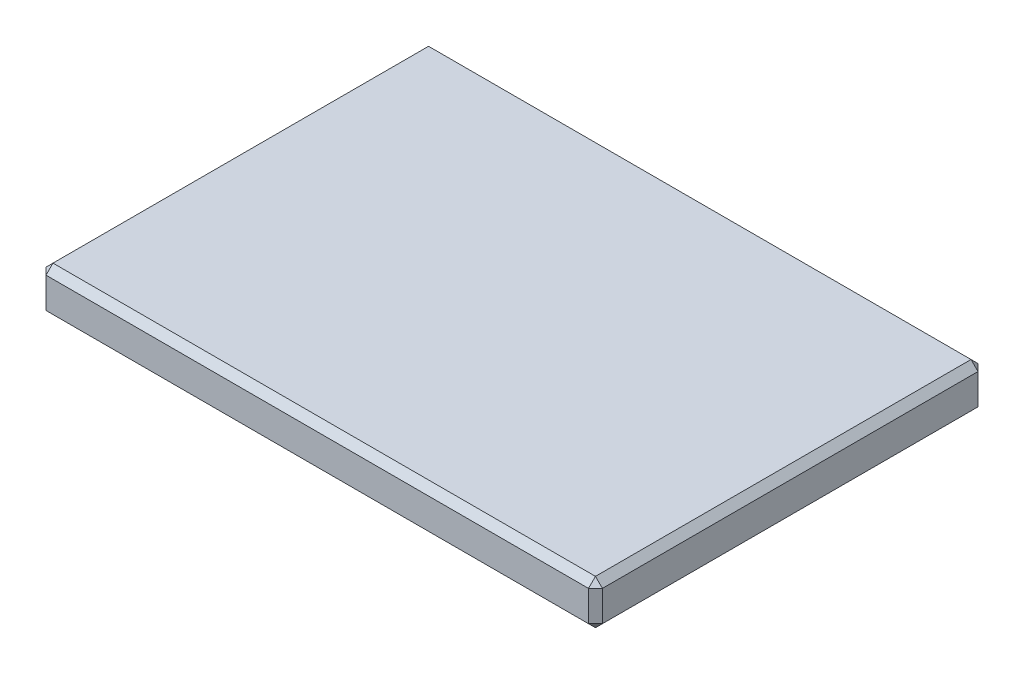
ISO-10303-21;
HEADER;
FILE_DESCRIPTION(('STEP AP214'),'2;1');
FILE_NAME('part.step','',(''),(''),'','','');
FILE_SCHEMA(('AUTOMOTIVE_DESIGN { 1 0 10303 214 1 1 1 1 }'));
ENDSEC;
DATA;
#1=APPLICATION_CONTEXT('core data for automotive mechanical design processes');
#2=APPLICATION_PROTOCOL_DEFINITION('international standard','automotive_design',2000,#1);
#3=PRODUCT_CONTEXT('',#1,'mechanical');
#4=PRODUCT('Part','Part','',(#3));
#5=PRODUCT_RELATED_PRODUCT_CATEGORY('part','',(#4));
#6=PRODUCT_DEFINITION_FORMATION('','',#4);
#7=PRODUCT_DEFINITION_CONTEXT('part definition',#1,'design');
#8=PRODUCT_DEFINITION('design','',#6,#7);
#9=PRODUCT_DEFINITION_SHAPE('','',#8);
#10=(LENGTH_UNIT() NAMED_UNIT(*) SI_UNIT(.MILLI.,.METRE.));
#11=(NAMED_UNIT(*) PLANE_ANGLE_UNIT() SI_UNIT($,.RADIAN.));
#12=(NAMED_UNIT(*) SI_UNIT($,.STERADIAN.) SOLID_ANGLE_UNIT());
#13=UNCERTAINTY_MEASURE_WITH_UNIT(LENGTH_MEASURE(1.E-05),#10,'distance_accuracy_value','');
#14=(GEOMETRIC_REPRESENTATION_CONTEXT(3) GLOBAL_UNCERTAINTY_ASSIGNED_CONTEXT((#13)) GLOBAL_UNIT_ASSIGNED_CONTEXT((#10,
#11,#12)) REPRESENTATION_CONTEXT('',''));
#15=CARTESIAN_POINT('',(0.,0.,0.));
#16=DIRECTION('',(0.,0.,1.));
#17=DIRECTION('',(1.,0.,0.));
#18=AXIS2_PLACEMENT_3D('',#15,#16,#17);
#19=CARTESIAN_POINT('',(0.,3.2,0.));
#20=DIRECTION('',(1.,0.,0.));
#21=DIRECTION('',(0.,0.,-1.));
#22=AXIS2_PLACEMENT_3D('',#19,#20,#21);
#23=PLANE('',#22);
#24=DIRECTION('',(0.,0.,1.));
#25=VECTOR('',#24,1.);
#26=CARTESIAN_POINT('',(0.,0.5,0.));
#27=LINE('',#26,#25);
#28=CARTESIAN_POINT('',(0.,0.5,-27.5));
#29=VERTEX_POINT('',#28);
#30=CARTESIAN_POINT('',(0.,0.5,-0.5));
#31=VERTEX_POINT('',#30);
#32=EDGE_CURVE('E197',#29,#31,#27,.T.);
#33=ORIENTED_EDGE('',*,*,#32,.T.);
#34=DIRECTION('',(0.,1.,0.));
#35=VECTOR('',#34,1.);
#36=CARTESIAN_POINT('',(0.,3.2,-0.5));
#37=LINE('',#36,#35);
#38=CARTESIAN_POINT('',(0.,2.7,-0.5));
#39=VERTEX_POINT('',#38);
#40=EDGE_CURVE('E200',#31,#39,#37,.T.);
#41=ORIENTED_EDGE('',*,*,#40,.T.);
#42=DIRECTION('',(0.,0.,-1.));
#43=VECTOR('',#42,1.);
#44=CARTESIAN_POINT('',(0.,2.7,0.));
#45=LINE('',#44,#43);
#46=CARTESIAN_POINT('',(0.,2.7,-27.5));
#47=VERTEX_POINT('',#46);
#48=EDGE_CURVE('E191',#39,#47,#45,.T.);
#49=ORIENTED_EDGE('',*,*,#48,.T.);
#50=DIRECTION('',(0.,-1.,0.));
#51=VECTOR('',#50,1.);
#52=CARTESIAN_POINT('',(0.,3.2,-27.5));
#53=LINE('',#52,#51);
#54=EDGE_CURVE('E194',#47,#29,#53,.T.);
#55=ORIENTED_EDGE('',*,*,#54,.T.);
#56=EDGE_LOOP('',(#33,#41,#49,#55));
#57=FACE_BOUND('',#56,.T.);
#58=ADVANCED_FACE('F39',(#57),#23,.F.);
#59=CARTESIAN_POINT('',(0.,3.2,0.));
#60=DIRECTION('',(0.,0.,-1.));
#61=DIRECTION('',(-1.,0.,0.));
#62=AXIS2_PLACEMENT_3D('',#59,#60,#61);
#63=PLANE('',#62);
#64=DIRECTION('',(0.,-1.,0.));
#65=VECTOR('',#64,1.);
#66=CARTESIAN_POINT('',(0.5,3.2,0.));
#67=LINE('',#66,#65);
#68=CARTESIAN_POINT('',(0.5,2.7,0.));
#69=VERTEX_POINT('',#68);
#70=CARTESIAN_POINT('',(0.5,0.5,0.));
#71=VERTEX_POINT('',#70);
#72=EDGE_CURVE('E181',#69,#71,#67,.T.);
#73=ORIENTED_EDGE('',*,*,#72,.T.);
#74=DIRECTION('',(1.,0.,0.));
#75=VECTOR('',#74,1.);
#76=CARTESIAN_POINT('',(40.,0.5,0.));
#77=LINE('',#76,#75);
#78=CARTESIAN_POINT('',(39.5,0.5,0.));
#79=VERTEX_POINT('',#78);
#80=EDGE_CURVE('E188',#71,#79,#77,.T.);
#81=ORIENTED_EDGE('',*,*,#80,.T.);
#82=DIRECTION('',(0.,1.,0.));
#83=VECTOR('',#82,1.);
#84=CARTESIAN_POINT('',(39.5,3.2,0.));
#85=LINE('',#84,#83);
#86=CARTESIAN_POINT('',(39.5,2.7,0.));
#87=VERTEX_POINT('',#86);
#88=EDGE_CURVE('E184',#79,#87,#85,.T.);
#89=ORIENTED_EDGE('',*,*,#88,.T.);
#90=DIRECTION('',(-1.,0.,0.));
#91=VECTOR('',#90,1.);
#92=CARTESIAN_POINT('',(0.,2.7,0.));
#93=LINE('',#92,#91);
#94=EDGE_CURVE('E178',#87,#69,#93,.T.);
#95=ORIENTED_EDGE('',*,*,#94,.T.);
#96=EDGE_LOOP('',(#73,#81,#89,#95));
#97=FACE_BOUND('',#96,.T.);
#98=ADVANCED_FACE('F358',(#97),#63,.F.);
#99=CARTESIAN_POINT('',(40.,3.2,0.));
#100=DIRECTION('',(-1.,0.,0.));
#101=DIRECTION('',(0.,0.,1.));
#102=AXIS2_PLACEMENT_3D('',#99,#100,#101);
#103=PLANE('',#102);
#104=DIRECTION('',(0.,-1.,0.));
#105=VECTOR('',#104,1.);
#106=CARTESIAN_POINT('',(40.,3.2,-0.5));
#107=LINE('',#106,#105);
#108=CARTESIAN_POINT('',(40.,2.7,-0.5));
#109=VERTEX_POINT('',#108);
#110=CARTESIAN_POINT('',(40.,0.5,-0.5));
#111=VERTEX_POINT('',#110);
#112=EDGE_CURVE('E140',#109,#111,#107,.T.);
#113=ORIENTED_EDGE('',*,*,#112,.T.);
#114=DIRECTION('',(0.,0.,-1.));
#115=VECTOR('',#114,1.);
#116=CARTESIAN_POINT('',(40.,0.5,-28.));
#117=LINE('',#116,#115);
#118=CARTESIAN_POINT('',(40.,0.5,-27.5));
#119=VERTEX_POINT('',#118);
#120=EDGE_CURVE('E135',#111,#119,#117,.T.);
#121=ORIENTED_EDGE('',*,*,#120,.T.);
#122=DIRECTION('',(0.,1.,0.));
#123=VECTOR('',#122,1.);
#124=CARTESIAN_POINT('',(40.,3.2,-27.5));
#125=LINE('',#124,#123);
#126=CARTESIAN_POINT('',(40.,2.7,-27.5));
#127=VERTEX_POINT('',#126);
#128=EDGE_CURVE('E127',#119,#127,#125,.T.);
#129=ORIENTED_EDGE('',*,*,#128,.T.);
#130=DIRECTION('',(0.,0.,1.));
#131=VECTOR('',#130,1.);
#132=CARTESIAN_POINT('',(40.,2.7,0.));
#133=LINE('',#132,#131);
#134=EDGE_CURVE('E132',#127,#109,#133,.T.);
#135=ORIENTED_EDGE('',*,*,#134,.T.);
#136=EDGE_LOOP('',(#113,#121,#129,#135));
#137=FACE_BOUND('',#136,.T.);
#138=ADVANCED_FACE('F130',(#137),#103,.F.);
#139=CARTESIAN_POINT('',(0.,3.2,-28.));
#140=DIRECTION('',(0.,0.,1.));
#141=DIRECTION('',(1.,0.,0.));
#142=AXIS2_PLACEMENT_3D('',#139,#140,#141);
#143=PLANE('',#142);
#144=DIRECTION('',(1.,0.,0.));
#145=VECTOR('',#144,1.);
#146=CARTESIAN_POINT('',(0.,2.7,-28.));
#147=LINE('',#146,#145);
#148=CARTESIAN_POINT('',(0.5,2.7,-28.));
#149=VERTEX_POINT('',#148);
#150=CARTESIAN_POINT('',(39.5,2.7,-28.));
#151=VERTEX_POINT('',#150);
#152=EDGE_CURVE('E204',#149,#151,#147,.T.);
#153=ORIENTED_EDGE('',*,*,#152,.T.);
#154=DIRECTION('',(0.,-1.,0.));
#155=VECTOR('',#154,1.);
#156=CARTESIAN_POINT('',(39.5,3.2,-28.));
#157=LINE('',#156,#155);
#158=CARTESIAN_POINT('',(39.5,0.5,-28.));
#159=VERTEX_POINT('',#158);
#160=EDGE_CURVE('E148',#151,#159,#157,.T.);
#161=ORIENTED_EDGE('',*,*,#160,.T.);
#162=DIRECTION('',(-1.,0.,0.));
#163=VECTOR('',#162,1.);
#164=CARTESIAN_POINT('',(0.,0.5,-28.));
#165=LINE('',#164,#163);
#166=CARTESIAN_POINT('',(0.5,0.5,-28.));
#167=VERTEX_POINT('',#166);
#168=EDGE_CURVE('E210',#159,#167,#165,.T.);
#169=ORIENTED_EDGE('',*,*,#168,.T.);
#170=DIRECTION('',(0.,1.,0.));
#171=VECTOR('',#170,1.);
#172=CARTESIAN_POINT('',(0.5,3.2,-28.));
#173=LINE('',#172,#171);
#174=EDGE_CURVE('E207',#167,#149,#173,.T.);
#175=ORIENTED_EDGE('',*,*,#174,.T.);
#176=EDGE_LOOP('',(#153,#161,#169,#175));
#177=FACE_BOUND('',#176,.T.);
#178=ADVANCED_FACE('F349',(#177),#143,.F.);
#179=CARTESIAN_POINT('',(0.,3.2,0.));
#180=DIRECTION('',(0.,-1.,0.));
#181=DIRECTION('',(0.,0.,-1.));
#182=AXIS2_PLACEMENT_3D('',#179,#180,#181);
#183=PLANE('',#182);
#184=DIRECTION('',(0.,0.,-1.));
#185=VECTOR('',#184,1.);
#186=CARTESIAN_POINT('',(39.5,3.2,0.));
#187=LINE('',#186,#185);
#188=CARTESIAN_POINT('',(39.5,3.2,-0.5));
#189=VERTEX_POINT('',#188);
#190=CARTESIAN_POINT('',(39.5,3.2,-27.5));
#191=VERTEX_POINT('',#190);
#192=EDGE_CURVE('E49',#189,#191,#187,.T.);
#193=ORIENTED_EDGE('',*,*,#192,.T.);
#194=DIRECTION('',(-1.,0.,0.));
#195=VECTOR('',#194,1.);
#196=CARTESIAN_POINT('',(0.,3.2,-27.5));
#197=LINE('',#196,#195);
#198=CARTESIAN_POINT('',(0.5,3.2,-27.5));
#199=VERTEX_POINT('',#198);
#200=EDGE_CURVE('E11',#191,#199,#197,.T.);
#201=ORIENTED_EDGE('',*,*,#200,.T.);
#202=DIRECTION('',(0.,0.,1.));
#203=VECTOR('',#202,1.);
#204=CARTESIAN_POINT('',(0.5,3.2,0.));
#205=LINE('',#204,#203);
#206=CARTESIAN_POINT('',(0.5,3.2,-0.5));
#207=VERTEX_POINT('',#206);
#208=EDGE_CURVE('E228',#199,#207,#205,.T.);
#209=ORIENTED_EDGE('',*,*,#208,.T.);
#210=DIRECTION('',(1.,0.,0.));
#211=VECTOR('',#210,1.);
#212=CARTESIAN_POINT('',(0.,3.2,-0.5));
#213=LINE('',#212,#211);
#214=EDGE_CURVE('E60',#207,#189,#213,.T.);
#215=ORIENTED_EDGE('',*,*,#214,.T.);
#216=EDGE_LOOP('',(#193,#201,#209,#215));
#217=FACE_BOUND('',#216,.T.);
#218=ADVANCED_FACE('F351',(#217),#183,.F.);
#219=CARTESIAN_POINT('',(0.,0.,0.));
#220=DIRECTION('',(0.,-1.,0.));
#221=DIRECTION('',(0.,0.,-1.));
#222=AXIS2_PLACEMENT_3D('',#219,#220,#221);
#223=PLANE('',#222);
#224=DIRECTION('',(0.,0.,1.));
#225=VECTOR('',#224,1.);
#226=CARTESIAN_POINT('',(39.5,0.,0.));
#227=LINE('',#226,#225);
#228=CARTESIAN_POINT('',(39.5,0.,-27.5));
#229=VERTEX_POINT('',#228);
#230=CARTESIAN_POINT('',(39.5,0.,-0.5));
#231=VERTEX_POINT('',#230);
#232=EDGE_CURVE('E221',#229,#231,#227,.T.);
#233=ORIENTED_EDGE('',*,*,#232,.T.);
#234=DIRECTION('',(-1.,0.,0.));
#235=VECTOR('',#234,1.);
#236=CARTESIAN_POINT('',(0.,0.,-0.5));
#237=LINE('',#236,#235);
#238=CARTESIAN_POINT('',(0.5,0.,-0.5));
#239=VERTEX_POINT('',#238);
#240=EDGE_CURVE('E224',#231,#239,#237,.T.);
#241=ORIENTED_EDGE('',*,*,#240,.T.);
#242=DIRECTION('',(0.,0.,-1.));
#243=VECTOR('',#242,1.);
#244=CARTESIAN_POINT('',(0.5,0.,-28.));
#245=LINE('',#244,#243);
#246=CARTESIAN_POINT('',(0.5,0.,-27.5));
#247=VERTEX_POINT('',#246);
#248=EDGE_CURVE('E215',#239,#247,#245,.T.);
#249=ORIENTED_EDGE('',*,*,#248,.T.);
#250=DIRECTION('',(1.,0.,0.));
#251=VECTOR('',#250,1.);
#252=CARTESIAN_POINT('',(40.,0.,-27.5));
#253=LINE('',#252,#251);
#254=EDGE_CURVE('E218',#247,#229,#253,.T.);
#255=ORIENTED_EDGE('',*,*,#254,.T.);
#256=EDGE_LOOP('',(#233,#241,#249,#255));
#257=FACE_BOUND('',#256,.T.);
#258=ADVANCED_FACE('F319',(#257),#223,.T.);
#259=CARTESIAN_POINT('',(0.,3.2,-27.5));
#260=DIRECTION('',(0.707106781186547,0.,0.707106781186547));
#261=DIRECTION('',(0.,-1.,0.));
#262=AXIS2_PLACEMENT_3D('',#259,#260,#261);
#263=PLANE('',#262);
#264=DIRECTION('',(0.707106781186547,0.,-0.707106781186547));
#265=VECTOR('',#264,1.);
#266=CARTESIAN_POINT('',(0.5,2.7,-28.));
#267=LINE('',#266,#265);
#268=EDGE_CURVE('E43',#149,#47,#267,.F.);
#269=ORIENTED_EDGE('',*,*,#268,.F.);
#270=ORIENTED_EDGE('',*,*,#174,.F.);
#271=DIRECTION('',(-0.707106781186547,0.,0.707106781186547));
#272=VECTOR('',#271,1.);
#273=CARTESIAN_POINT('',(0.5,0.5,-28.));
#274=LINE('',#273,#272);
#275=EDGE_CURVE('E172',#29,#167,#274,.F.);
#276=ORIENTED_EDGE('',*,*,#275,.F.);
#277=ORIENTED_EDGE('',*,*,#54,.F.);
#278=EDGE_LOOP('',(#269,#270,#276,#277));
#279=FACE_BOUND('',#278,.T.);
#280=ADVANCED_FACE('F41',(#279),#263,.F.);
#281=CARTESIAN_POINT('',(0.5,2.7,-28.));
#282=DIRECTION('',(-0.577350269189626,0.577350269189626,-0.577350269189626));
#283=DIRECTION('',(-0.707106781186547,0.,0.707106781186547));
#284=AXIS2_PLACEMENT_3D('',#281,#282,#283);
#285=PLANE('',#284);
#286=DIRECTION('',(0.,0.707106781186547,0.707106781186547));
#287=VECTOR('',#286,1.);
#288=CARTESIAN_POINT('',(0.5,2.7,-28.));
#289=LINE('',#288,#287);
#290=EDGE_CURVE('E294',#149,#199,#289,.T.);
#291=ORIENTED_EDGE('',*,*,#290,.F.);
#292=ORIENTED_EDGE('',*,*,#268,.T.);
#293=DIRECTION('',(-0.707106781186547,-0.707106781186547,0.));
#294=VECTOR('',#293,1.);
#295=CARTESIAN_POINT('',(0.25,2.95,-27.5));
#296=LINE('',#295,#294);
#297=EDGE_CURVE('E298',#199,#47,#296,.T.);
#298=ORIENTED_EDGE('',*,*,#297,.F.);
#299=EDGE_LOOP('',(#291,#292,#298));
#300=FACE_BOUND('',#299,.T.);
#301=ADVANCED_FACE('F344',(#300),#285,.T.);
#302=CARTESIAN_POINT('',(0.5,0.5,-28.));
#303=DIRECTION('',(-0.577350269189626,-0.577350269189626,-0.577350269189626));
#304=DIRECTION('',(-0.707106781186547,0.,0.707106781186547));
#305=AXIS2_PLACEMENT_3D('',#302,#303,#304);
#306=PLANE('',#305);
#307=DIRECTION('',(-0.707106781186547,0.707106781186547,0.));
#308=VECTOR('',#307,1.);
#309=CARTESIAN_POINT('',(0.25,0.25,-27.5));
#310=LINE('',#309,#308);
#311=EDGE_CURVE('E286',#29,#247,#310,.F.);
#312=ORIENTED_EDGE('',*,*,#311,.F.);
#313=ORIENTED_EDGE('',*,*,#275,.T.);
#314=DIRECTION('',(0.,-0.707106781186547,0.707106781186547));
#315=VECTOR('',#314,1.);
#316=CARTESIAN_POINT('',(0.5,0.5,-28.));
#317=LINE('',#316,#315);
#318=EDGE_CURVE('E290',#247,#167,#317,.F.);
#319=ORIENTED_EDGE('',*,*,#318,.F.);
#320=EDGE_LOOP('',(#312,#313,#319));
#321=FACE_BOUND('',#320,.T.);
#322=ADVANCED_FACE('F307',(#321),#306,.T.);
#323=CARTESIAN_POINT('',(0.5,3.2,0.));
#324=DIRECTION('',(0.707106781186547,-0.707106781186547,0.));
#325=DIRECTION('',(0.,0.,1.));
#326=AXIS2_PLACEMENT_3D('',#323,#324,#325);
#327=PLANE('',#326);
#328=ORIENTED_EDGE('',*,*,#297,.T.);
#329=ORIENTED_EDGE('',*,*,#48,.F.);
#330=DIRECTION('',(0.707106781186547,0.707106781186547,0.));
#331=VECTOR('',#330,1.);
#332=CARTESIAN_POINT('',(0.,2.7,-0.5));
#333=LINE('',#332,#331);
#334=EDGE_CURVE('E279',#207,#39,#333,.F.);
#335=ORIENTED_EDGE('',*,*,#334,.F.);
#336=ORIENTED_EDGE('',*,*,#208,.F.);
#337=EDGE_LOOP('',(#328,#329,#335,#336));
#338=FACE_BOUND('',#337,.T.);
#339=ADVANCED_FACE('F339',(#338),#327,.F.);
#340=CARTESIAN_POINT('',(0.,3.2,-27.5));
#341=DIRECTION('',(0.,-0.707106781186547,0.707106781186547));
#342=DIRECTION('',(-1.,0.,0.));
#343=AXIS2_PLACEMENT_3D('',#340,#341,#342);
#344=PLANE('',#343);
#345=ORIENTED_EDGE('',*,*,#290,.T.);
#346=ORIENTED_EDGE('',*,*,#200,.F.);
#347=DIRECTION('',(0.,-0.707106781186547,-0.707106781186547));
#348=VECTOR('',#347,1.);
#349=CARTESIAN_POINT('',(39.5,2.95,-27.75));
#350=LINE('',#349,#348);
#351=EDGE_CURVE('E153',#151,#191,#350,.F.);
#352=ORIENTED_EDGE('',*,*,#351,.F.);
#353=ORIENTED_EDGE('',*,*,#152,.F.);
#354=EDGE_LOOP('',(#345,#346,#352,#353));
#355=FACE_BOUND('',#354,.T.);
#356=ADVANCED_FACE('F347',(#355),#344,.F.);
#357=CARTESIAN_POINT('',(39.5,3.2,-28.));
#358=DIRECTION('',(-0.707106781186547,0.,0.707106781186547));
#359=DIRECTION('',(0.,-1.,0.));
#360=AXIS2_PLACEMENT_3D('',#357,#358,#359);
#361=PLANE('',#360);
#362=DIRECTION('',(-0.707106781186547,0.,-0.707106781186547));
#363=VECTOR('',#362,1.);
#364=CARTESIAN_POINT('',(39.5,0.5,-28.));
#365=LINE('',#364,#363);
#366=EDGE_CURVE('E154',#159,#119,#365,.F.);
#367=ORIENTED_EDGE('',*,*,#366,.F.);
#368=ORIENTED_EDGE('',*,*,#160,.F.);
#369=DIRECTION('',(0.707106781186547,0.,0.707106781186547));
#370=VECTOR('',#369,1.);
#371=CARTESIAN_POINT('',(40.,2.7,-27.5));
#372=LINE('',#371,#370);
#373=EDGE_CURVE('E144',#127,#151,#372,.F.);
#374=ORIENTED_EDGE('',*,*,#373,.F.);
#375=ORIENTED_EDGE('',*,*,#128,.F.);
#376=EDGE_LOOP('',(#367,#368,#374,#375));
#377=FACE_BOUND('',#376,.T.);
#378=ADVANCED_FACE('F146',(#377),#361,.F.);
#379=CARTESIAN_POINT('',(0.,0.5,-28.));
#380=DIRECTION('',(0.,-0.707106781186547,-0.707106781186547));
#381=DIRECTION('',(1.,0.,0.));
#382=AXIS2_PLACEMENT_3D('',#379,#380,#381);
#383=PLANE('',#382);
#384=ORIENTED_EDGE('',*,*,#318,.T.);
#385=ORIENTED_EDGE('',*,*,#168,.F.);
#386=DIRECTION('',(0.,0.707106781186547,-0.707106781186547));
#387=VECTOR('',#386,1.);
#388=CARTESIAN_POINT('',(39.5,0.5,-28.));
#389=LINE('',#388,#387);
#390=EDGE_CURVE('E272',#229,#159,#389,.T.);
#391=ORIENTED_EDGE('',*,*,#390,.F.);
#392=ORIENTED_EDGE('',*,*,#254,.F.);
#393=EDGE_LOOP('',(#384,#385,#391,#392));
#394=FACE_BOUND('',#393,.T.);
#395=ADVANCED_FACE('F315',(#394),#383,.T.);
#396=CARTESIAN_POINT('',(0.,0.5,0.));
#397=DIRECTION('',(-0.707106781186547,-0.707106781186547,0.));
#398=DIRECTION('',(0.,0.,-1.));
#399=AXIS2_PLACEMENT_3D('',#396,#397,#398);
#400=PLANE('',#399);
#401=ORIENTED_EDGE('',*,*,#311,.T.);
#402=ORIENTED_EDGE('',*,*,#248,.F.);
#403=DIRECTION('',(0.707106781186547,-0.707106781186547,0.));
#404=VECTOR('',#403,1.);
#405=CARTESIAN_POINT('',(0.25,0.25,-0.5));
#406=LINE('',#405,#404);
#407=EDGE_CURVE('E268',#31,#239,#406,.T.);
#408=ORIENTED_EDGE('',*,*,#407,.F.);
#409=ORIENTED_EDGE('',*,*,#32,.F.);
#410=EDGE_LOOP('',(#401,#402,#408,#409));
#411=FACE_BOUND('',#410,.T.);
#412=ADVANCED_FACE('F325',(#411),#400,.T.);
#413=CARTESIAN_POINT('',(0.5,3.2,0.));
#414=DIRECTION('',(0.707106781186547,0.,-0.707106781186547));
#415=DIRECTION('',(0.,-1.,0.));
#416=AXIS2_PLACEMENT_3D('',#413,#414,#415);
#417=PLANE('',#416);
#418=DIRECTION('',(-0.707106781186547,0.,-0.707106781186547));
#419=VECTOR('',#418,1.);
#420=CARTESIAN_POINT('',(0.,2.7,-0.5));
#421=LINE('',#420,#419);
#422=EDGE_CURVE('E282',#39,#69,#421,.F.);
#423=ORIENTED_EDGE('',*,*,#422,.F.);
#424=ORIENTED_EDGE('',*,*,#40,.F.);
#425=DIRECTION('',(0.707106781186547,0.,0.707106781186547));
#426=VECTOR('',#425,1.);
#427=CARTESIAN_POINT('',(0.5,0.5,0.));
#428=LINE('',#427,#426);
#429=EDGE_CURVE('E264',#71,#31,#428,.F.);
#430=ORIENTED_EDGE('',*,*,#429,.F.);
#431=ORIENTED_EDGE('',*,*,#72,.F.);
#432=EDGE_LOOP('',(#423,#424,#430,#431));
#433=FACE_BOUND('',#432,.T.);
#434=ADVANCED_FACE('F331',(#433),#417,.F.);
#435=CARTESIAN_POINT('',(0.,2.7,-0.5));
#436=DIRECTION('',(-0.577350269189626,0.577350269189626,0.577350269189626));
#437=DIRECTION('',(0.707106781186547,0.,0.707106781186547));
#438=AXIS2_PLACEMENT_3D('',#435,#436,#437);
#439=PLANE('',#438);
#440=ORIENTED_EDGE('',*,*,#334,.T.);
#441=ORIENTED_EDGE('',*,*,#422,.T.);
#442=DIRECTION('',(0.,-0.707106781186547,0.707106781186547));
#443=VECTOR('',#442,1.);
#444=CARTESIAN_POINT('',(0.5,2.95,-0.25));
#445=LINE('',#444,#443);
#446=EDGE_CURVE('E161',#207,#69,#445,.T.);
#447=ORIENTED_EDGE('',*,*,#446,.F.);
#448=EDGE_LOOP('',(#440,#441,#447));
#449=FACE_BOUND('',#448,.T.);
#450=ADVANCED_FACE('F405',(#449),#439,.T.);
#451=CARTESIAN_POINT('',(40.,2.7,-27.5));
#452=DIRECTION('',(0.577350269189626,0.577350269189626,-0.577350269189626));
#453=DIRECTION('',(-0.707106781186547,0.,-0.707106781186547));
#454=AXIS2_PLACEMENT_3D('',#451,#452,#453);
#455=PLANE('',#454);
#456=ORIENTED_EDGE('',*,*,#373,.T.);
#457=ORIENTED_EDGE('',*,*,#351,.T.);
#458=DIRECTION('',(-0.707106781186547,0.707106781186547,0.));
#459=VECTOR('',#458,1.);
#460=CARTESIAN_POINT('',(40.,2.7,-27.5));
#461=LINE('',#460,#459);
#462=EDGE_CURVE('E157',#127,#191,#461,.T.);
#463=ORIENTED_EDGE('',*,*,#462,.F.);
#464=EDGE_LOOP('',(#456,#457,#463));
#465=FACE_BOUND('',#464,.T.);
#466=ADVANCED_FACE('F158',(#465),#455,.T.);
#467=CARTESIAN_POINT('',(39.5,0.5,-28.));
#468=DIRECTION('',(0.577350269189626,-0.577350269189626,-0.577350269189626));
#469=DIRECTION('',(-0.707106781186547,0.,-0.707106781186547));
#470=AXIS2_PLACEMENT_3D('',#467,#468,#469);
#471=PLANE('',#470);
#472=ORIENTED_EDGE('',*,*,#390,.T.);
#473=ORIENTED_EDGE('',*,*,#366,.T.);
#474=DIRECTION('',(-0.707106781186547,-0.707106781186547,0.));
#475=VECTOR('',#474,1.);
#476=CARTESIAN_POINT('',(39.75,0.25,-27.5));
#477=LINE('',#476,#475);
#478=EDGE_CURVE('E162',#229,#119,#477,.F.);
#479=ORIENTED_EDGE('',*,*,#478,.F.);
#480=EDGE_LOOP('',(#472,#473,#479));
#481=FACE_BOUND('',#480,.T.);
#482=ADVANCED_FACE('F398',(#481),#471,.T.);
#483=CARTESIAN_POINT('',(0.5,0.5,0.));
#484=DIRECTION('',(-0.577350269189626,-0.577350269189626,0.577350269189626));
#485=DIRECTION('',(0.707106781186547,0.,0.707106781186547));
#486=AXIS2_PLACEMENT_3D('',#483,#484,#485);
#487=PLANE('',#486);
#488=ORIENTED_EDGE('',*,*,#429,.T.);
#489=ORIENTED_EDGE('',*,*,#407,.T.);
#490=DIRECTION('',(0.,0.707106781186547,0.707106781186547));
#491=VECTOR('',#490,1.);
#492=CARTESIAN_POINT('',(0.5,0.5,0.));
#493=LINE('',#492,#491);
#494=EDGE_CURVE('E255',#71,#239,#493,.F.);
#495=ORIENTED_EDGE('',*,*,#494,.F.);
#496=EDGE_LOOP('',(#488,#489,#495));
#497=FACE_BOUND('',#496,.T.);
#498=ADVANCED_FACE('F394',(#497),#487,.T.);
#499=CARTESIAN_POINT('',(0.,3.2,-0.5));
#500=DIRECTION('',(0.,-0.707106781186547,-0.707106781186547));
#501=DIRECTION('',(1.,0.,0.));
#502=AXIS2_PLACEMENT_3D('',#499,#500,#501);
#503=PLANE('',#502);
#504=ORIENTED_EDGE('',*,*,#446,.T.);
#505=ORIENTED_EDGE('',*,*,#94,.F.);
#506=DIRECTION('',(0.,0.707106781186547,-0.707106781186547));
#507=VECTOR('',#506,1.);
#508=CARTESIAN_POINT('',(39.5,2.7,0.));
#509=LINE('',#508,#507);
#510=EDGE_CURVE('E251',#189,#87,#509,.F.);
#511=ORIENTED_EDGE('',*,*,#510,.F.);
#512=ORIENTED_EDGE('',*,*,#214,.F.);
#513=EDGE_LOOP('',(#504,#505,#511,#512));
#514=FACE_BOUND('',#513,.T.);
#515=ADVANCED_FACE('F391',(#514),#503,.F.);
#516=CARTESIAN_POINT('',(39.5,3.2,0.));
#517=DIRECTION('',(-0.707106781186547,-0.707106781186547,0.));
#518=DIRECTION('',(0.,0.,-1.));
#519=AXIS2_PLACEMENT_3D('',#516,#517,#518);
#520=PLANE('',#519);
#521=ORIENTED_EDGE('',*,*,#462,.T.);
#522=ORIENTED_EDGE('',*,*,#192,.F.);
#523=DIRECTION('',(0.707106781186547,-0.707106781186547,0.));
#524=VECTOR('',#523,1.);
#525=CARTESIAN_POINT('',(39.75,2.95,-0.5));
#526=LINE('',#525,#524);
#527=EDGE_CURVE('E166',#109,#189,#526,.F.);
#528=ORIENTED_EDGE('',*,*,#527,.F.);
#529=ORIENTED_EDGE('',*,*,#134,.F.);
#530=EDGE_LOOP('',(#521,#522,#528,#529));
#531=FACE_BOUND('',#530,.T.);
#532=ADVANCED_FACE('F164',(#531),#520,.F.);
#533=CARTESIAN_POINT('',(40.,0.5,0.));
#534=DIRECTION('',(0.707106781186547,-0.707106781186547,0.));
#535=DIRECTION('',(0.,0.,1.));
#536=AXIS2_PLACEMENT_3D('',#533,#534,#535);
#537=PLANE('',#536);
#538=ORIENTED_EDGE('',*,*,#478,.T.);
#539=ORIENTED_EDGE('',*,*,#120,.F.);
#540=DIRECTION('',(0.707106781186547,0.707106781186547,0.));
#541=VECTOR('',#540,1.);
#542=CARTESIAN_POINT('',(40.,0.5,-0.5));
#543=LINE('',#542,#541);
#544=EDGE_CURVE('E245',#231,#111,#543,.T.);
#545=ORIENTED_EDGE('',*,*,#544,.F.);
#546=ORIENTED_EDGE('',*,*,#232,.F.);
#547=EDGE_LOOP('',(#538,#539,#545,#546));
#548=FACE_BOUND('',#547,.T.);
#549=ADVANCED_FACE('F384',(#548),#537,.T.);
#550=CARTESIAN_POINT('',(0.,0.5,0.));
#551=DIRECTION('',(0.,-0.707106781186547,0.707106781186547));
#552=DIRECTION('',(-1.,0.,0.));
#553=AXIS2_PLACEMENT_3D('',#550,#551,#552);
#554=PLANE('',#553);
#555=ORIENTED_EDGE('',*,*,#494,.T.);
#556=ORIENTED_EDGE('',*,*,#240,.F.);
#557=DIRECTION('',(0.,-0.707106781186547,-0.707106781186547));
#558=VECTOR('',#557,1.);
#559=CARTESIAN_POINT('',(39.5,0.25,-0.25));
#560=LINE('',#559,#558);
#561=EDGE_CURVE('E241',#79,#231,#560,.T.);
#562=ORIENTED_EDGE('',*,*,#561,.F.);
#563=ORIENTED_EDGE('',*,*,#80,.F.);
#564=EDGE_LOOP('',(#555,#556,#562,#563));
#565=FACE_BOUND('',#564,.T.);
#566=ADVANCED_FACE('F380',(#565),#554,.T.);
#567=CARTESIAN_POINT('',(39.5,2.7,0.));
#568=DIRECTION('',(0.577350269189626,0.577350269189626,0.577350269189626));
#569=DIRECTION('',(0.707106781186547,0.,-0.707106781186547));
#570=AXIS2_PLACEMENT_3D('',#567,#568,#569);
#571=PLANE('',#570);
#572=ORIENTED_EDGE('',*,*,#527,.T.);
#573=ORIENTED_EDGE('',*,*,#510,.T.);
#574=DIRECTION('',(-0.707106781186547,0.,0.707106781186547));
#575=VECTOR('',#574,1.);
#576=CARTESIAN_POINT('',(39.5,2.7,0.));
#577=LINE('',#576,#575);
#578=EDGE_CURVE('E238',#109,#87,#577,.T.);
#579=ORIENTED_EDGE('',*,*,#578,.F.);
#580=EDGE_LOOP('',(#572,#573,#579));
#581=FACE_BOUND('',#580,.T.);
#582=ADVANCED_FACE('F376',(#581),#571,.T.);
#583=CARTESIAN_POINT('',(40.,0.5,-0.5));
#584=DIRECTION('',(0.577350269189626,-0.577350269189626,0.577350269189626));
#585=DIRECTION('',(0.707106781186547,0.,-0.707106781186547));
#586=AXIS2_PLACEMENT_3D('',#583,#584,#585);
#587=PLANE('',#586);
#588=ORIENTED_EDGE('',*,*,#561,.T.);
#589=ORIENTED_EDGE('',*,*,#544,.T.);
#590=DIRECTION('',(0.707106781186547,0.,-0.707106781186547));
#591=VECTOR('',#590,1.);
#592=CARTESIAN_POINT('',(40.,0.5,-0.5));
#593=LINE('',#592,#591);
#594=EDGE_CURVE('E235',#79,#111,#593,.T.);
#595=ORIENTED_EDGE('',*,*,#594,.F.);
#596=EDGE_LOOP('',(#588,#589,#595));
#597=FACE_BOUND('',#596,.T.);
#598=ADVANCED_FACE('F372',(#597),#587,.T.);
#599=CARTESIAN_POINT('',(40.,3.2,-0.5));
#600=DIRECTION('',(-0.707106781186547,0.,-0.707106781186547));
#601=DIRECTION('',(0.,-1.,0.));
#602=AXIS2_PLACEMENT_3D('',#599,#600,#601);
#603=PLANE('',#602);
#604=ORIENTED_EDGE('',*,*,#578,.T.);
#605=ORIENTED_EDGE('',*,*,#88,.F.);
#606=ORIENTED_EDGE('',*,*,#594,.T.);
#607=ORIENTED_EDGE('',*,*,#112,.F.);
#608=EDGE_LOOP('',(#604,#605,#606,#607));
#609=FACE_BOUND('',#608,.T.);
#610=ADVANCED_FACE('F369',(#609),#603,.F.);
#611=CLOSED_SHELL('',(#58,#98,#138,#178,#218,#258,#280,#301,#322,#339,#356,#378,#395,#412,#434,
#450,#466,#482,#498,#515,#532,#549,#566,#582,#598,#610));
#612=MANIFOLD_SOLID_BREP('B2',#611);
#613=ADVANCED_BREP_SHAPE_REPRESENTATION('',(#18,#612),#14);
#614=SHAPE_DEFINITION_REPRESENTATION(#9,#613);
ENDSEC;
END-ISO-10303-21;
